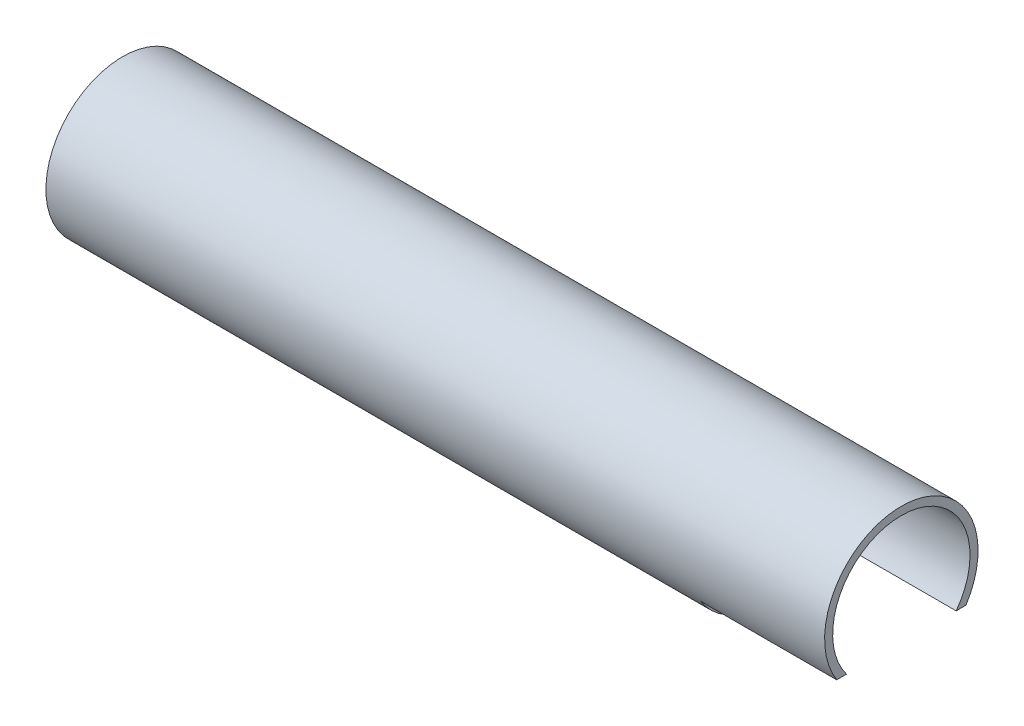
ISO-10303-21;
HEADER;
FILE_DESCRIPTION(('STEP AP214'),'2;1');
FILE_NAME('part.step','',(''),(''),'','','');
FILE_SCHEMA(('AUTOMOTIVE_DESIGN { 1 0 10303 214 1 1 1 1 }'));
ENDSEC;
DATA;
#1=APPLICATION_CONTEXT('core data for automotive mechanical design processes');
#2=APPLICATION_PROTOCOL_DEFINITION('international standard','automotive_design',2000,#1);
#3=PRODUCT_CONTEXT('',#1,'mechanical');
#4=PRODUCT('Part','Part','',(#3));
#5=PRODUCT_RELATED_PRODUCT_CATEGORY('part','',(#4));
#6=PRODUCT_DEFINITION_FORMATION('','',#4);
#7=PRODUCT_DEFINITION_CONTEXT('part definition',#1,'design');
#8=PRODUCT_DEFINITION('design','',#6,#7);
#9=PRODUCT_DEFINITION_SHAPE('','',#8);
#10=(LENGTH_UNIT() NAMED_UNIT(*) SI_UNIT(.MILLI.,.METRE.));
#11=(NAMED_UNIT(*) PLANE_ANGLE_UNIT() SI_UNIT($,.RADIAN.));
#12=(NAMED_UNIT(*) SI_UNIT($,.STERADIAN.) SOLID_ANGLE_UNIT());
#13=UNCERTAINTY_MEASURE_WITH_UNIT(LENGTH_MEASURE(1.E-05),#10,'distance_accuracy_value','');
#14=(GEOMETRIC_REPRESENTATION_CONTEXT(3) GLOBAL_UNCERTAINTY_ASSIGNED_CONTEXT((#13)) GLOBAL_UNIT_ASSIGNED_CONTEXT((#10,
#11,#12)) REPRESENTATION_CONTEXT('',''));
#15=CARTESIAN_POINT('',(0.,0.,0.));
#16=DIRECTION('',(0.,0.,1.));
#17=DIRECTION('',(1.,0.,0.));
#18=AXIS2_PLACEMENT_3D('',#15,#16,#17);
#19=CARTESIAN_POINT('',(580.,0.,0.));
#20=DIRECTION('',(1.,0.,0.));
#21=DIRECTION('',(0.,0.,-1.));
#22=AXIS2_PLACEMENT_3D('',#19,#20,#21);
#23=PLANE('',#22);
#24=CARTESIAN_POINT('',(580.,0.,0.));
#25=DIRECTION('',(1.,0.,0.));
#26=DIRECTION('',(0.,0.,-1.));
#27=AXIS2_PLACEMENT_3D('',#24,#25,#26);
#28=CIRCLE('',#27,57.15);
#29=CARTESIAN_POINT('',(580.,-30.8,-48.1402378473559));
#30=VERTEX_POINT('',#29);
#31=CARTESIAN_POINT('',(580.,-30.8,48.1402378473559));
#32=VERTEX_POINT('',#31);
#33=EDGE_CURVE('E11',#30,#32,#28,.T.);
#34=ORIENTED_EDGE('',*,*,#33,.T.);
#35=DIRECTION('',(0.,0.,-1.));
#36=VECTOR('',#35,1.);
#37=CARTESIAN_POINT('',(580.,-30.8,0.));
#38=LINE('',#37,#36);
#39=CARTESIAN_POINT('',(580.,-30.8,40.8372685178625));
#40=VERTEX_POINT('',#39);
#41=EDGE_CURVE('E77',#32,#40,#38,.T.);
#42=ORIENTED_EDGE('',*,*,#41,.T.);
#43=CARTESIAN_POINT('',(580.,0.,0.));
#44=DIRECTION('',(1.,0.,0.));
#45=DIRECTION('',(0.,0.,-1.));
#46=AXIS2_PLACEMENT_3D('',#43,#44,#45);
#47=CIRCLE('',#46,51.15);
#48=CARTESIAN_POINT('',(580.,-30.8,-40.8372685178625));
#49=VERTEX_POINT('',#48);
#50=EDGE_CURVE('E100',#49,#40,#47,.T.);
#51=ORIENTED_EDGE('',*,*,#50,.F.);
#52=EDGE_CURVE('E88',#49,#30,#38,.T.);
#53=ORIENTED_EDGE('',*,*,#52,.T.);
#54=EDGE_LOOP('',(#34,#42,#51,#53));
#55=FACE_BOUND('',#54,.T.);
#56=ADVANCED_FACE('F33',(#55),#23,.T.);
#57=CARTESIAN_POINT('',(580.,0.,0.));
#58=DIRECTION('',(-1.,0.,0.));
#59=DIRECTION('',(0.,0.,1.));
#60=AXIS2_PLACEMENT_3D('',#57,#58,#59);
#61=CYLINDRICAL_SURFACE('',#60,57.15);
#62=CARTESIAN_POINT('',(0.,0.,0.));
#63=DIRECTION('',(1.,0.,0.));
#64=DIRECTION('',(0.,0.,-1.));
#65=AXIS2_PLACEMENT_3D('',#62,#63,#64);
#66=CIRCLE('',#65,57.15);
#67=CARTESIAN_POINT('',(0.,0.,-57.15));
#68=VERTEX_POINT('',#67);
#69=EDGE_CURVE('E37',#68,#68,#66,.T.);
#70=ORIENTED_EDGE('',*,*,#69,.T.);
#71=EDGE_LOOP('',(#70));
#72=FACE_BOUND('',#71,.T.);
#73=DIRECTION('',(1.,0.,0.));
#74=VECTOR('',#73,1.);
#75=CARTESIAN_POINT('',(478.4,-30.8,48.1402378473559));
#76=LINE('',#75,#74);
#77=CARTESIAN_POINT('',(478.4,-30.8,48.1402378473559));
#78=VERTEX_POINT('',#77);
#79=EDGE_CURVE('E75',#78,#32,#76,.T.);
#80=ORIENTED_EDGE('',*,*,#79,.T.);
#81=ORIENTED_EDGE('',*,*,#33,.F.);
#82=DIRECTION('',(1.,0.,0.));
#83=VECTOR('',#82,1.);
#84=CARTESIAN_POINT('',(478.4,-30.8,-48.1402378473559));
#85=LINE('',#84,#83);
#86=CARTESIAN_POINT('',(478.4,-30.8,-48.1402378473559));
#87=VERTEX_POINT('',#86);
#88=EDGE_CURVE('E81',#87,#30,#85,.T.);
#89=ORIENTED_EDGE('',*,*,#88,.F.);
#90=CARTESIAN_POINT('',(478.4,0.,0.));
#91=DIRECTION('',(1.,0.,0.));
#92=DIRECTION('',(0.,0.,-1.));
#93=AXIS2_PLACEMENT_3D('',#90,#91,#92);
#94=CIRCLE('',#93,57.15);
#95=EDGE_CURVE('E85',#78,#87,#94,.T.);
#96=ORIENTED_EDGE('',*,*,#95,.F.);
#97=EDGE_LOOP('',(#80,#81,#89,#96));
#98=FACE_BOUND('',#97,.T.);
#99=ADVANCED_FACE('F35',(#72,#98),#61,.T.);
#100=CARTESIAN_POINT('',(580.,0.,0.));
#101=DIRECTION('',(-1.,0.,0.));
#102=DIRECTION('',(0.,0.,1.));
#103=AXIS2_PLACEMENT_3D('',#100,#101,#102);
#104=CYLINDRICAL_SURFACE('',#103,51.15);
#105=CARTESIAN_POINT('',(0.,0.,0.));
#106=DIRECTION('',(1.,0.,0.));
#107=DIRECTION('',(0.,0.,-1.));
#108=AXIS2_PLACEMENT_3D('',#105,#106,#107);
#109=CIRCLE('',#108,51.15);
#110=CARTESIAN_POINT('',(0.,0.,-51.15));
#111=VERTEX_POINT('',#110);
#112=EDGE_CURVE('E95',#111,#111,#109,.T.);
#113=ORIENTED_EDGE('',*,*,#112,.F.);
#114=EDGE_LOOP('',(#113));
#115=FACE_BOUND('',#114,.T.);
#116=ORIENTED_EDGE('',*,*,#50,.T.);
#117=DIRECTION('',(1.,0.,0.));
#118=VECTOR('',#117,1.);
#119=CARTESIAN_POINT('',(478.4,-30.8,40.8372685178625));
#120=LINE('',#119,#118);
#121=CARTESIAN_POINT('',(478.4,-30.8,40.8372685178625));
#122=VERTEX_POINT('',#121);
#123=EDGE_CURVE('E72',#122,#40,#120,.T.);
#124=ORIENTED_EDGE('',*,*,#123,.F.);
#125=CARTESIAN_POINT('',(478.4,0.,0.));
#126=DIRECTION('',(1.,0.,0.));
#127=DIRECTION('',(0.,0.,-1.));
#128=AXIS2_PLACEMENT_3D('',#125,#126,#127);
#129=CIRCLE('',#128,51.15);
#130=CARTESIAN_POINT('',(478.4,-30.8,-40.8372685178625));
#131=VERTEX_POINT('',#130);
#132=EDGE_CURVE('E82',#131,#122,#129,.F.);
#133=ORIENTED_EDGE('',*,*,#132,.F.);
#134=DIRECTION('',(1.,0.,0.));
#135=VECTOR('',#134,1.);
#136=CARTESIAN_POINT('',(478.4,-30.8,-40.8372685178625));
#137=LINE('',#136,#135);
#138=EDGE_CURVE('E96',#131,#49,#137,.T.);
#139=ORIENTED_EDGE('',*,*,#138,.T.);
#140=EDGE_LOOP('',(#116,#124,#133,#139));
#141=FACE_BOUND('',#140,.T.);
#142=ADVANCED_FACE('F108',(#115,#141),#104,.F.);
#143=CARTESIAN_POINT('',(0.,0.,0.));
#144=DIRECTION('',(1.,0.,0.));
#145=DIRECTION('',(0.,0.,-1.));
#146=AXIS2_PLACEMENT_3D('',#143,#144,#145);
#147=PLANE('',#146);
#148=ORIENTED_EDGE('',*,*,#69,.F.);
#149=EDGE_LOOP('',(#148));
#150=FACE_BOUND('',#149,.T.);
#151=ORIENTED_EDGE('',*,*,#112,.T.);
#152=EDGE_LOOP('',(#151));
#153=FACE_BOUND('',#152,.T.);
#154=ADVANCED_FACE('F106',(#150,#153),#147,.F.);
#155=CARTESIAN_POINT('',(478.4,-30.8,0.));
#156=DIRECTION('',(0.,-1.,0.));
#157=DIRECTION('',(0.,0.,-1.));
#158=AXIS2_PLACEMENT_3D('',#155,#156,#157);
#159=PLANE('',#158);
#160=ORIENTED_EDGE('',*,*,#41,.F.);
#161=ORIENTED_EDGE('',*,*,#79,.F.);
#162=DIRECTION('',(0.,0.,-1.));
#163=VECTOR('',#162,1.);
#164=CARTESIAN_POINT('',(478.4,-30.8,0.));
#165=LINE('',#164,#163);
#166=EDGE_CURVE('E57',#78,#122,#165,.T.);
#167=ORIENTED_EDGE('',*,*,#166,.T.);
#168=ORIENTED_EDGE('',*,*,#123,.T.);
#169=EDGE_LOOP('',(#160,#161,#167,#168));
#170=FACE_BOUND('',#169,.T.);
#171=ADVANCED_FACE('F76',(#170),#159,.T.);
#172=ORIENTED_EDGE('',*,*,#52,.F.);
#173=ORIENTED_EDGE('',*,*,#138,.F.);
#174=EDGE_CURVE('E48',#131,#87,#165,.T.);
#175=ORIENTED_EDGE('',*,*,#174,.T.);
#176=ORIENTED_EDGE('',*,*,#88,.T.);
#177=EDGE_LOOP('',(#172,#173,#175,#176));
#178=FACE_BOUND('',#177,.T.);
#179=ADVANCED_FACE('F116',(#178),#159,.T.);
#180=CARTESIAN_POINT('',(478.4,0.,0.));
#181=DIRECTION('',(1.,0.,0.));
#182=DIRECTION('',(0.,0.,-1.));
#183=AXIS2_PLACEMENT_3D('',#180,#181,#182);
#184=PLANE('',#183);
#185=ORIENTED_EDGE('',*,*,#166,.F.);
#186=ORIENTED_EDGE('',*,*,#95,.T.);
#187=ORIENTED_EDGE('',*,*,#174,.F.);
#188=ORIENTED_EDGE('',*,*,#132,.T.);
#189=EDGE_LOOP('',(#185,#186,#187,#188));
#190=FACE_BOUND('',#189,.T.);
#191=ADVANCED_FACE('F84',(#190),#184,.T.);
#192=CLOSED_SHELL('',(#56,#99,#142,#154,#171,#179,#191));
#193=MANIFOLD_SOLID_BREP('B2',#192);
#194=ADVANCED_BREP_SHAPE_REPRESENTATION('',(#18,#193),#14);
#195=SHAPE_DEFINITION_REPRESENTATION(#9,#194);
ENDSEC;
END-ISO-10303-21;
